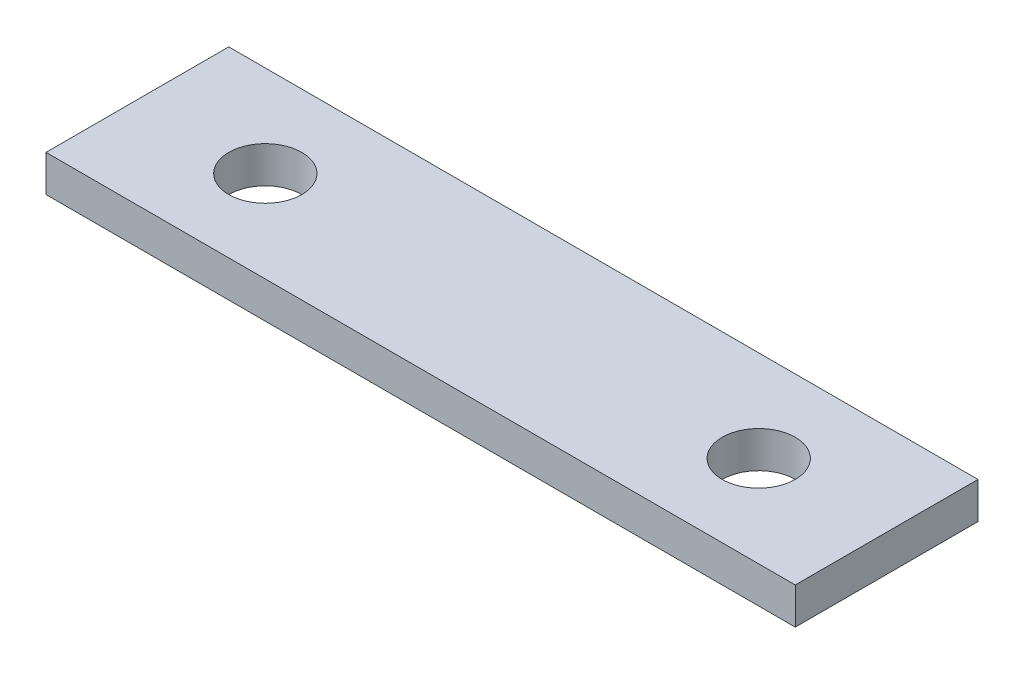
ISO-10303-21;
HEADER;
FILE_DESCRIPTION(('STEP AP214'),'2;1');
FILE_NAME('part.step','',(''),(''),'','','');
FILE_SCHEMA(('AUTOMOTIVE_DESIGN { 1 0 10303 214 1 1 1 1 }'));
ENDSEC;
DATA;
#1=APPLICATION_CONTEXT('core data for automotive mechanical design processes');
#2=APPLICATION_PROTOCOL_DEFINITION('international standard','automotive_design',2000,#1);
#3=PRODUCT_CONTEXT('',#1,'mechanical');
#4=PRODUCT('Part','Part','',(#3));
#5=PRODUCT_RELATED_PRODUCT_CATEGORY('part','',(#4));
#6=PRODUCT_DEFINITION_FORMATION('','',#4);
#7=PRODUCT_DEFINITION_CONTEXT('part definition',#1,'design');
#8=PRODUCT_DEFINITION('design','',#6,#7);
#9=PRODUCT_DEFINITION_SHAPE('','',#8);
#10=(LENGTH_UNIT() NAMED_UNIT(*) SI_UNIT(.MILLI.,.METRE.));
#11=(NAMED_UNIT(*) PLANE_ANGLE_UNIT() SI_UNIT($,.RADIAN.));
#12=(NAMED_UNIT(*) SI_UNIT($,.STERADIAN.) SOLID_ANGLE_UNIT());
#13=UNCERTAINTY_MEASURE_WITH_UNIT(LENGTH_MEASURE(1.E-05),#10,'distance_accuracy_value','');
#14=(GEOMETRIC_REPRESENTATION_CONTEXT(3) GLOBAL_UNCERTAINTY_ASSIGNED_CONTEXT((#13)) GLOBAL_UNIT_ASSIGNED_CONTEXT((#10,
#11,#12)) REPRESENTATION_CONTEXT('',''));
#15=CARTESIAN_POINT('',(0.,0.,0.));
#16=DIRECTION('',(0.,0.,1.));
#17=DIRECTION('',(1.,0.,0.));
#18=AXIS2_PLACEMENT_3D('',#15,#16,#17);
#19=CARTESIAN_POINT('',(0.,2.,0.));
#20=DIRECTION('',(0.,0.,-1.));
#21=DIRECTION('',(-1.,0.,0.));
#22=AXIS2_PLACEMENT_3D('',#19,#20,#21);
#23=PLANE('',#22);
#24=DIRECTION('',(1.,0.,0.));
#25=VECTOR('',#24,1.);
#26=CARTESIAN_POINT('',(0.,0.,0.));
#27=LINE('',#26,#25);
#28=CARTESIAN_POINT('',(-3.,0.,0.));
#29=VERTEX_POINT('',#28);
#30=CARTESIAN_POINT('',(38.,0.,0.));
#31=VERTEX_POINT('',#30);
#32=EDGE_CURVE('E49',#29,#31,#27,.T.);
#33=ORIENTED_EDGE('',*,*,#32,.T.);
#34=DIRECTION('',(0.,-1.,0.));
#35=VECTOR('',#34,1.);
#36=CARTESIAN_POINT('',(38.,0.,0.));
#37=LINE('',#36,#35);
#38=CARTESIAN_POINT('',(38.,2.,0.));
#39=VERTEX_POINT('',#38);
#40=EDGE_CURVE('E76',#39,#31,#37,.T.);
#41=ORIENTED_EDGE('',*,*,#40,.F.);
#42=DIRECTION('',(1.,0.,0.));
#43=VECTOR('',#42,1.);
#44=CARTESIAN_POINT('',(0.,2.,0.));
#45=LINE('',#44,#43);
#46=CARTESIAN_POINT('',(-3.,2.,0.));
#47=VERTEX_POINT('',#46);
#48=EDGE_CURVE('E41',#47,#39,#45,.T.);
#49=ORIENTED_EDGE('',*,*,#48,.F.);
#50=DIRECTION('',(0.,1.,0.));
#51=VECTOR('',#50,1.);
#52=CARTESIAN_POINT('',(-3.,2.,0.));
#53=LINE('',#52,#51);
#54=EDGE_CURVE('E78',#29,#47,#53,.T.);
#55=ORIENTED_EDGE('',*,*,#54,.F.);
#56=EDGE_LOOP('',(#33,#41,#49,#55));
#57=FACE_BOUND('',#56,.T.);
#58=ADVANCED_FACE('F33',(#57),#23,.F.);
#59=CARTESIAN_POINT('',(0.,2.,-10.));
#60=DIRECTION('',(0.,0.,1.));
#61=DIRECTION('',(1.,0.,0.));
#62=AXIS2_PLACEMENT_3D('',#59,#60,#61);
#63=PLANE('',#62);
#64=DIRECTION('',(-1.,0.,0.));
#65=VECTOR('',#64,1.);
#66=CARTESIAN_POINT('',(0.,0.,-10.));
#67=LINE('',#66,#65);
#68=CARTESIAN_POINT('',(38.,0.,-10.));
#69=VERTEX_POINT('',#68);
#70=CARTESIAN_POINT('',(-3.,0.,-10.));
#71=VERTEX_POINT('',#70);
#72=EDGE_CURVE('E36',#69,#71,#67,.T.);
#73=ORIENTED_EDGE('',*,*,#72,.T.);
#74=DIRECTION('',(0.,-1.,0.));
#75=VECTOR('',#74,1.);
#76=CARTESIAN_POINT('',(-3.,2.,-10.));
#77=LINE('',#76,#75);
#78=CARTESIAN_POINT('',(-3.,2.,-10.));
#79=VERTEX_POINT('',#78);
#80=EDGE_CURVE('E99',#79,#71,#77,.T.);
#81=ORIENTED_EDGE('',*,*,#80,.F.);
#82=DIRECTION('',(-1.,0.,0.));
#83=VECTOR('',#82,1.);
#84=CARTESIAN_POINT('',(0.,2.,-10.));
#85=LINE('',#84,#83);
#86=CARTESIAN_POINT('',(38.,2.,-10.));
#87=VERTEX_POINT('',#86);
#88=EDGE_CURVE('E11',#87,#79,#85,.T.);
#89=ORIENTED_EDGE('',*,*,#88,.F.);
#90=DIRECTION('',(0.,1.,0.));
#91=VECTOR('',#90,1.);
#92=CARTESIAN_POINT('',(38.,0.,-10.));
#93=LINE('',#92,#91);
#94=EDGE_CURVE('E85',#69,#87,#93,.T.);
#95=ORIENTED_EDGE('',*,*,#94,.F.);
#96=EDGE_LOOP('',(#73,#81,#89,#95));
#97=FACE_BOUND('',#96,.T.);
#98=ADVANCED_FACE('F119',(#97),#63,.F.);
#99=CARTESIAN_POINT('',(0.,2.,0.));
#100=DIRECTION('',(0.,-1.,0.));
#101=DIRECTION('',(0.,0.,-1.));
#102=AXIS2_PLACEMENT_3D('',#99,#100,#101);
#103=PLANE('',#102);
#104=CARTESIAN_POINT('',(4.,2.,-5.));
#105=DIRECTION('',(0.,-1.,0.));
#106=DIRECTION('',(0.,0.,-1.));
#107=AXIS2_PLACEMENT_3D('',#104,#105,#106);
#108=CIRCLE('',#107,2.);
#109=CARTESIAN_POINT('',(4.,2.,-7.));
#110=VERTEX_POINT('',#109);
#111=EDGE_CURVE('E79',#110,#110,#108,.T.);
#112=ORIENTED_EDGE('',*,*,#111,.T.);
#113=EDGE_LOOP('',(#112));
#114=FACE_BOUND('',#113,.T.);
#115=CARTESIAN_POINT('',(31.,2.,-5.));
#116=DIRECTION('',(0.,-1.,0.));
#117=DIRECTION('',(0.,0.,-1.));
#118=AXIS2_PLACEMENT_3D('',#115,#116,#117);
#119=CIRCLE('',#118,2.00000000000001);
#120=CARTESIAN_POINT('',(31.,2.,-7.00000000000001));
#121=VERTEX_POINT('',#120);
#122=EDGE_CURVE('E107',#121,#121,#119,.T.);
#123=ORIENTED_EDGE('',*,*,#122,.T.);
#124=EDGE_LOOP('',(#123));
#125=FACE_BOUND('',#124,.T.);
#126=ORIENTED_EDGE('',*,*,#88,.T.);
#127=DIRECTION('',(0.,0.,-1.));
#128=VECTOR('',#127,1.);
#129=CARTESIAN_POINT('',(-3.,2.,0.));
#130=LINE('',#129,#128);
#131=EDGE_CURVE('E96',#47,#79,#130,.T.);
#132=ORIENTED_EDGE('',*,*,#131,.F.);
#133=ORIENTED_EDGE('',*,*,#48,.T.);
#134=DIRECTION('',(0.,0.,1.));
#135=VECTOR('',#134,1.);
#136=CARTESIAN_POINT('',(38.,2.,0.));
#137=LINE('',#136,#135);
#138=EDGE_CURVE('E90',#87,#39,#137,.T.);
#139=ORIENTED_EDGE('',*,*,#138,.F.);
#140=EDGE_LOOP('',(#126,#132,#133,#139));
#141=FACE_BOUND('',#140,.T.);
#142=ADVANCED_FACE('F116',(#114,#125,#141),#103,.F.);
#143=CARTESIAN_POINT('',(0.,0.,0.));
#144=DIRECTION('',(0.,-1.,0.));
#145=DIRECTION('',(0.,0.,-1.));
#146=AXIS2_PLACEMENT_3D('',#143,#144,#145);
#147=PLANE('',#146);
#148=CARTESIAN_POINT('',(4.,0.,-5.));
#149=DIRECTION('',(0.,-1.,0.));
#150=DIRECTION('',(0.,0.,-1.));
#151=AXIS2_PLACEMENT_3D('',#148,#149,#150);
#152=CIRCLE('',#151,2.);
#153=CARTESIAN_POINT('',(4.,0.,-7.));
#154=VERTEX_POINT('',#153);
#155=EDGE_CURVE('E104',#154,#154,#152,.T.);
#156=ORIENTED_EDGE('',*,*,#155,.F.);
#157=EDGE_LOOP('',(#156));
#158=FACE_BOUND('',#157,.T.);
#159=CARTESIAN_POINT('',(31.,0.,-5.));
#160=DIRECTION('',(0.,-1.,0.));
#161=DIRECTION('',(0.,0.,-1.));
#162=AXIS2_PLACEMENT_3D('',#159,#160,#161);
#163=CIRCLE('',#162,2.00000000000001);
#164=CARTESIAN_POINT('',(31.,0.,-7.00000000000001));
#165=VERTEX_POINT('',#164);
#166=EDGE_CURVE('E103',#165,#165,#163,.T.);
#167=ORIENTED_EDGE('',*,*,#166,.F.);
#168=EDGE_LOOP('',(#167));
#169=FACE_BOUND('',#168,.T.);
#170=ORIENTED_EDGE('',*,*,#32,.F.);
#171=DIRECTION('',(0.,0.,1.));
#172=VECTOR('',#171,1.);
#173=CARTESIAN_POINT('',(-3.,0.,0.));
#174=LINE('',#173,#172);
#175=EDGE_CURVE('E101',#71,#29,#174,.T.);
#176=ORIENTED_EDGE('',*,*,#175,.F.);
#177=ORIENTED_EDGE('',*,*,#72,.F.);
#178=DIRECTION('',(0.,0.,-1.));
#179=VECTOR('',#178,1.);
#180=CARTESIAN_POINT('',(38.,0.,0.));
#181=LINE('',#180,#179);
#182=EDGE_CURVE('E81',#31,#69,#181,.T.);
#183=ORIENTED_EDGE('',*,*,#182,.F.);
#184=EDGE_LOOP('',(#170,#176,#177,#183));
#185=FACE_BOUND('',#184,.T.);
#186=ADVANCED_FACE('F82',(#158,#169,#185),#147,.T.);
#187=CARTESIAN_POINT('',(31.,20.,-5.));
#188=DIRECTION('',(0.,-1.,0.));
#189=DIRECTION('',(0.,0.,-1.));
#190=AXIS2_PLACEMENT_3D('',#187,#188,#189);
#191=CYLINDRICAL_SURFACE('',#190,2.00000000000001);
#192=ORIENTED_EDGE('',*,*,#166,.T.);
#193=EDGE_LOOP('',(#192));
#194=FACE_BOUND('',#193,.T.);
#195=ORIENTED_EDGE('',*,*,#122,.F.);
#196=EDGE_LOOP('',(#195));
#197=FACE_BOUND('',#196,.T.);
#198=ADVANCED_FACE('F129',(#194,#197),#191,.F.);
#199=CARTESIAN_POINT('',(4.,20.,-5.));
#200=DIRECTION('',(0.,-1.,0.));
#201=DIRECTION('',(0.,0.,-1.));
#202=AXIS2_PLACEMENT_3D('',#199,#200,#201);
#203=CYLINDRICAL_SURFACE('',#202,2.);
#204=ORIENTED_EDGE('',*,*,#155,.T.);
#205=EDGE_LOOP('',(#204));
#206=FACE_BOUND('',#205,.T.);
#207=ORIENTED_EDGE('',*,*,#111,.F.);
#208=EDGE_LOOP('',(#207));
#209=FACE_BOUND('',#208,.T.);
#210=ADVANCED_FACE('F134',(#206,#209),#203,.F.);
#211=CARTESIAN_POINT('',(-3.,0.,0.));
#212=DIRECTION('',(1.,0.,0.));
#213=DIRECTION('',(0.,0.,-1.));
#214=AXIS2_PLACEMENT_3D('',#211,#212,#213);
#215=PLANE('',#214);
#216=ORIENTED_EDGE('',*,*,#54,.T.);
#217=ORIENTED_EDGE('',*,*,#131,.T.);
#218=ORIENTED_EDGE('',*,*,#80,.T.);
#219=ORIENTED_EDGE('',*,*,#175,.T.);
#220=EDGE_LOOP('',(#216,#217,#218,#219));
#221=FACE_BOUND('',#220,.T.);
#222=ADVANCED_FACE('F118',(#221),#215,.F.);
#223=CARTESIAN_POINT('',(38.,0.,0.));
#224=DIRECTION('',(-1.,0.,0.));
#225=DIRECTION('',(0.,0.,1.));
#226=AXIS2_PLACEMENT_3D('',#223,#224,#225);
#227=PLANE('',#226);
#228=ORIENTED_EDGE('',*,*,#40,.T.);
#229=ORIENTED_EDGE('',*,*,#182,.T.);
#230=ORIENTED_EDGE('',*,*,#94,.T.);
#231=ORIENTED_EDGE('',*,*,#138,.T.);
#232=EDGE_LOOP('',(#228,#229,#230,#231));
#233=FACE_BOUND('',#232,.T.);
#234=ADVANCED_FACE('F88',(#233),#227,.F.);
#235=CLOSED_SHELL('',(#58,#98,#142,#186,#198,#210,#222,#234));
#236=MANIFOLD_SOLID_BREP('B2',#235);
#237=ADVANCED_BREP_SHAPE_REPRESENTATION('',(#18,#236),#14);
#238=SHAPE_DEFINITION_REPRESENTATION(#9,#237);
ENDSEC;
END-ISO-10303-21;
